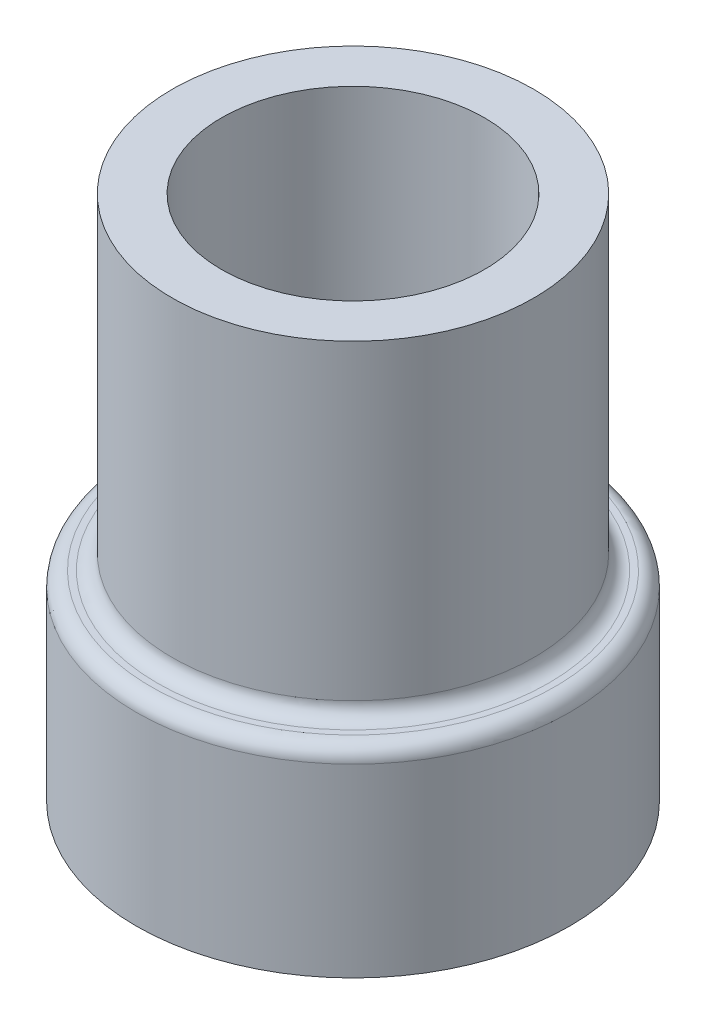
ISO-10303-21;
HEADER;
FILE_DESCRIPTION(('STEP AP214'),'2;1');
FILE_NAME('part.step','',(''),(''),'','','');
FILE_SCHEMA(('AUTOMOTIVE_DESIGN { 1 0 10303 214 1 1 1 1 }'));
ENDSEC;
DATA;
#1=APPLICATION_CONTEXT('core data for automotive mechanical design processes');
#2=APPLICATION_PROTOCOL_DEFINITION('international standard','automotive_design',2000,#1);
#3=PRODUCT_CONTEXT('',#1,'mechanical');
#4=PRODUCT('Part','Part','',(#3));
#5=PRODUCT_RELATED_PRODUCT_CATEGORY('part','',(#4));
#6=PRODUCT_DEFINITION_FORMATION('','',#4);
#7=PRODUCT_DEFINITION_CONTEXT('part definition',#1,'design');
#8=PRODUCT_DEFINITION('design','',#6,#7);
#9=PRODUCT_DEFINITION_SHAPE('','',#8);
#10=(LENGTH_UNIT() NAMED_UNIT(*) SI_UNIT(.MILLI.,.METRE.));
#11=(NAMED_UNIT(*) PLANE_ANGLE_UNIT() SI_UNIT($,.RADIAN.));
#12=(NAMED_UNIT(*) SI_UNIT($,.STERADIAN.) SOLID_ANGLE_UNIT());
#13=UNCERTAINTY_MEASURE_WITH_UNIT(LENGTH_MEASURE(1.E-05),#10,'distance_accuracy_value','');
#14=(GEOMETRIC_REPRESENTATION_CONTEXT(3) GLOBAL_UNCERTAINTY_ASSIGNED_CONTEXT((#13)) GLOBAL_UNIT_ASSIGNED_CONTEXT((#10,
#11,#12)) REPRESENTATION_CONTEXT('',''));
#15=CARTESIAN_POINT('',(0.,0.,0.));
#16=DIRECTION('',(0.,0.,1.));
#17=DIRECTION('',(1.,0.,0.));
#18=AXIS2_PLACEMENT_3D('',#15,#16,#17);
#19=CARTESIAN_POINT('',(0.,0.,0.));
#20=DIRECTION('',(0.,1.,0.));
#21=DIRECTION('',(0.,0.,1.));
#22=AXIS2_PLACEMENT_3D('',#19,#20,#21);
#23=PLANE('',#22);
#24=CARTESIAN_POINT('',(0.,0.,0.));
#25=DIRECTION('',(0.,-1.,0.));
#26=DIRECTION('',(0.,0.,-1.));
#27=AXIS2_PLACEMENT_3D('',#24,#25,#26);
#28=CIRCLE('',#27,21.971);
#29=CARTESIAN_POINT('',(0.,0.,-21.971));
#30=VERTEX_POINT('',#29);
#31=EDGE_CURVE('E63',#30,#30,#28,.T.);
#32=ORIENTED_EDGE('',*,*,#31,.T.);
#33=EDGE_LOOP('',(#32));
#34=FACE_BOUND('',#33,.T.);
#35=ADVANCED_FACE('F35',(#34),#23,.F.);
#36=CARTESIAN_POINT('',(0.,20.2692,0.));
#37=DIRECTION('',(0.,1.,0.));
#38=DIRECTION('',(0.,0.,1.));
#39=AXIS2_PLACEMENT_3D('',#36,#37,#38);
#40=PLANE('',#39);
#41=CARTESIAN_POINT('',(0.,20.2692,0.));
#42=DIRECTION('',(0.,-1.,0.));
#43=DIRECTION('',(0.,0.,-1.));
#44=AXIS2_PLACEMENT_3D('',#41,#42,#43);
#45=CIRCLE('',#44,13.335);
#46=CARTESIAN_POINT('',(0.,20.2692,-13.335));
#47=VERTEX_POINT('',#46);
#48=EDGE_CURVE('E10',#47,#47,#45,.T.);
#49=ORIENTED_EDGE('',*,*,#48,.F.);
#50=EDGE_LOOP('',(#49));
#51=FACE_BOUND('',#50,.T.);
#52=ADVANCED_FACE('F92',(#51),#40,.T.);
#53=CARTESIAN_POINT('',(0.,0.,0.));
#54=DIRECTION('',(0.,-1.,0.));
#55=DIRECTION('',(0.,0.,-1.));
#56=AXIS2_PLACEMENT_3D('',#53,#54,#55);
#57=CYLINDRICAL_SURFACE('',#56,13.335);
#58=ORIENTED_EDGE('',*,*,#48,.T.);
#59=EDGE_LOOP('',(#58));
#60=FACE_BOUND('',#59,.T.);
#61=CARTESIAN_POINT('',(0.,53.34,0.));
#62=DIRECTION('',(0.,-1.,0.));
#63=DIRECTION('',(0.,0.,-1.));
#64=AXIS2_PLACEMENT_3D('',#61,#62,#63);
#65=CIRCLE('',#64,13.335);
#66=CARTESIAN_POINT('',(0.,53.34,-13.335));
#67=VERTEX_POINT('',#66);
#68=EDGE_CURVE('E41',#67,#67,#65,.T.);
#69=ORIENTED_EDGE('',*,*,#68,.F.);
#70=EDGE_LOOP('',(#69));
#71=FACE_BOUND('',#70,.T.);
#72=ADVANCED_FACE('F96',(#60,#71),#57,.F.);
#73=CARTESIAN_POINT('',(0.,53.34,0.));
#74=DIRECTION('',(0.,1.,0.));
#75=DIRECTION('',(0.,0.,1.));
#76=AXIS2_PLACEMENT_3D('',#73,#74,#75);
#77=PLANE('',#76);
#78=ORIENTED_EDGE('',*,*,#68,.T.);
#79=EDGE_LOOP('',(#78));
#80=FACE_BOUND('',#79,.T.);
#81=CARTESIAN_POINT('',(0.,53.34,0.));
#82=DIRECTION('',(0.,-1.,0.));
#83=DIRECTION('',(0.,0.,-1.));
#84=AXIS2_PLACEMENT_3D('',#81,#82,#83);
#85=CIRCLE('',#84,18.335);
#86=CARTESIAN_POINT('',(0.,53.34,-18.335));
#87=VERTEX_POINT('',#86);
#88=EDGE_CURVE('E45',#87,#87,#85,.T.);
#89=ORIENTED_EDGE('',*,*,#88,.F.);
#90=EDGE_LOOP('',(#89));
#91=FACE_BOUND('',#90,.T.);
#92=ADVANCED_FACE('F101',(#80,#91),#77,.T.);
#93=CARTESIAN_POINT('',(0.,0.,0.));
#94=DIRECTION('',(0.,-1.,0.));
#95=DIRECTION('',(0.,0.,-1.));
#96=AXIS2_PLACEMENT_3D('',#93,#94,#95);
#97=CYLINDRICAL_SURFACE('',#96,18.335);
#98=ORIENTED_EDGE('',*,*,#88,.T.);
#99=EDGE_LOOP('',(#98));
#100=FACE_BOUND('',#99,.T.);
#101=CARTESIAN_POINT('',(0.,21.7692,0.));
#102=DIRECTION('',(0.,-1.,0.));
#103=DIRECTION('',(0.,0.,-1.));
#104=AXIS2_PLACEMENT_3D('',#101,#102,#103);
#105=CIRCLE('',#104,18.335);
#106=CARTESIAN_POINT('',(0.,21.7692,-18.335));
#107=VERTEX_POINT('',#106);
#108=EDGE_CURVE('E49',#107,#107,#105,.T.);
#109=ORIENTED_EDGE('',*,*,#108,.F.);
#110=EDGE_LOOP('',(#109));
#111=FACE_BOUND('',#110,.T.);
#112=ADVANCED_FACE('F88',(#100,#111),#97,.T.);
#113=CARTESIAN_POINT('',(0.,21.7692,0.));
#114=DIRECTION('',(0.,-1.,0.));
#115=DIRECTION('',(0.,0.,-1.));
#116=AXIS2_PLACEMENT_3D('',#113,#114,#115);
#117=TOROIDAL_SURFACE('',#116,19.835,1.5);
#118=ORIENTED_EDGE('',*,*,#108,.T.);
#119=EDGE_LOOP('',(#118));
#120=FACE_BOUND('',#119,.T.);
#121=CARTESIAN_POINT('',(0.,20.2692,0.));
#122=DIRECTION('',(0.,-1.,0.));
#123=DIRECTION('',(0.,0.,-1.));
#124=AXIS2_PLACEMENT_3D('',#121,#122,#123);
#125=CIRCLE('',#124,19.835);
#126=CARTESIAN_POINT('',(0.,20.2692,-19.835));
#127=VERTEX_POINT('',#126);
#128=EDGE_CURVE('E54',#127,#127,#125,.T.);
#129=ORIENTED_EDGE('',*,*,#128,.F.);
#130=EDGE_LOOP('',(#129));
#131=FACE_BOUND('',#130,.T.);
#132=ADVANCED_FACE('F82',(#120,#131),#117,.F.);
#133=CARTESIAN_POINT('',(-1.10570619746132E-13,20.2692,0.));
#134=DIRECTION('',(0.,1.,0.));
#135=DIRECTION('',(0.,0.,1.));
#136=AXIS2_PLACEMENT_3D('',#133,#134,#135);
#137=PLANE('',#136);
#138=ORIENTED_EDGE('',*,*,#128,.T.);
#139=EDGE_LOOP('',(#138));
#140=FACE_BOUND('',#139,.T.);
#141=CARTESIAN_POINT('',(0.,20.2692,0.));
#142=DIRECTION('',(0.,-1.,0.));
#143=DIRECTION('',(0.,0.,-1.));
#144=AXIS2_PLACEMENT_3D('',#141,#142,#143);
#145=CIRCLE('',#144,20.471);
#146=CARTESIAN_POINT('',(0.,20.2692,-20.471));
#147=VERTEX_POINT('',#146);
#148=EDGE_CURVE('E57',#147,#147,#145,.T.);
#149=ORIENTED_EDGE('',*,*,#148,.F.);
#150=EDGE_LOOP('',(#149));
#151=FACE_BOUND('',#150,.T.);
#152=ADVANCED_FACE('F77',(#140,#151),#137,.T.);
#153=CARTESIAN_POINT('',(0.,18.7692,0.));
#154=DIRECTION('',(0.,-1.,0.));
#155=DIRECTION('',(0.,0.,-1.));
#156=AXIS2_PLACEMENT_3D('',#153,#154,#155);
#157=TOROIDAL_SURFACE('',#156,20.471,1.5);
#158=CARTESIAN_POINT('',(0.,18.7692,0.));
#159=DIRECTION('',(0.,-1.,0.));
#160=DIRECTION('',(0.,0.,-1.));
#161=AXIS2_PLACEMENT_3D('',#158,#159,#160);
#162=CIRCLE('',#161,21.971);
#163=CARTESIAN_POINT('',(0.,18.7692,-21.971));
#164=VERTEX_POINT('',#163);
#165=EDGE_CURVE('E60',#164,#164,#162,.T.);
#166=ORIENTED_EDGE('',*,*,#165,.F.);
#167=EDGE_LOOP('',(#166));
#168=FACE_BOUND('',#167,.T.);
#169=ORIENTED_EDGE('',*,*,#148,.T.);
#170=EDGE_LOOP('',(#169));
#171=FACE_BOUND('',#170,.T.);
#172=ADVANCED_FACE('F71',(#168,#171),#157,.T.);
#173=CARTESIAN_POINT('',(0.,0.,0.));
#174=DIRECTION('',(0.,-1.,0.));
#175=DIRECTION('',(0.,0.,-1.));
#176=AXIS2_PLACEMENT_3D('',#173,#174,#175);
#177=CYLINDRICAL_SURFACE('',#176,21.971);
#178=ORIENTED_EDGE('',*,*,#31,.F.);
#179=EDGE_LOOP('',(#178));
#180=FACE_BOUND('',#179,.T.);
#181=ORIENTED_EDGE('',*,*,#165,.T.);
#182=EDGE_LOOP('',(#181));
#183=FACE_BOUND('',#182,.T.);
#184=ADVANCED_FACE('F68',(#180,#183),#177,.T.);
#185=CLOSED_SHELL('',(#35,#52,#72,#92,#112,#132,#152,#172,#184));
#186=MANIFOLD_SOLID_BREP('B2',#185);
#187=ADVANCED_BREP_SHAPE_REPRESENTATION('',(#18,#186),#14);
#188=SHAPE_DEFINITION_REPRESENTATION(#9,#187);
ENDSEC;
END-ISO-10303-21;
